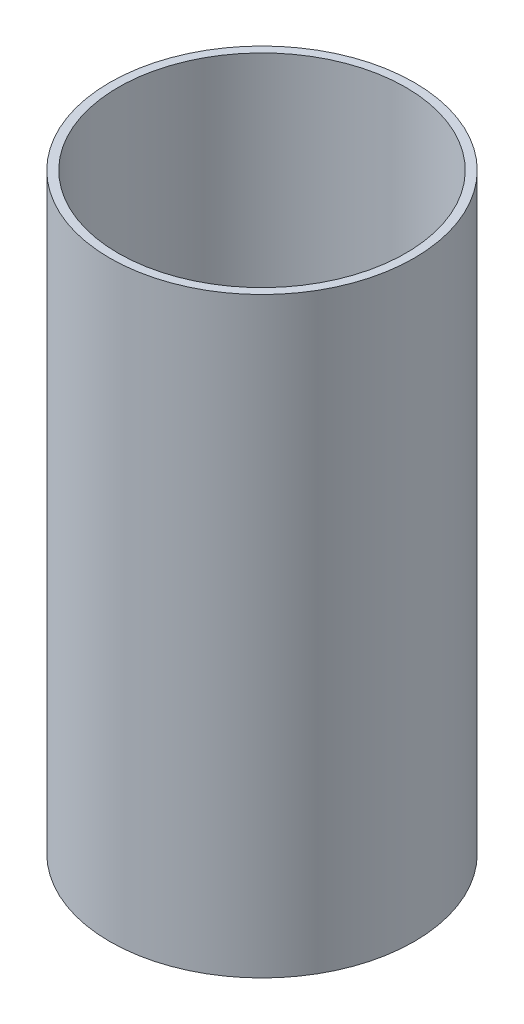
ISO-10303-21;
HEADER;
FILE_DESCRIPTION(('STEP AP214'),'2;1');
FILE_NAME('part.step','',(''),(''),'','','');
FILE_SCHEMA(('AUTOMOTIVE_DESIGN { 1 0 10303 214 1 1 1 1 }'));
ENDSEC;
DATA;
#1=APPLICATION_CONTEXT('core data for automotive mechanical design processes');
#2=APPLICATION_PROTOCOL_DEFINITION('international standard','automotive_design',2000,#1);
#3=PRODUCT_CONTEXT('',#1,'mechanical');
#4=PRODUCT('Part','Part','',(#3));
#5=PRODUCT_RELATED_PRODUCT_CATEGORY('part','',(#4));
#6=PRODUCT_DEFINITION_FORMATION('','',#4);
#7=PRODUCT_DEFINITION_CONTEXT('part definition',#1,'design');
#8=PRODUCT_DEFINITION('design','',#6,#7);
#9=PRODUCT_DEFINITION_SHAPE('','',#8);
#10=(LENGTH_UNIT() NAMED_UNIT(*) SI_UNIT(.MILLI.,.METRE.));
#11=(NAMED_UNIT(*) PLANE_ANGLE_UNIT() SI_UNIT($,.RADIAN.));
#12=(NAMED_UNIT(*) SI_UNIT($,.STERADIAN.) SOLID_ANGLE_UNIT());
#13=UNCERTAINTY_MEASURE_WITH_UNIT(LENGTH_MEASURE(1.E-05),#10,'distance_accuracy_value','');
#14=(GEOMETRIC_REPRESENTATION_CONTEXT(3) GLOBAL_UNCERTAINTY_ASSIGNED_CONTEXT((#13)) GLOBAL_UNIT_ASSIGNED_CONTEXT((#10,
#11,#12)) REPRESENTATION_CONTEXT('',''));
#15=CARTESIAN_POINT('',(0.,0.,0.));
#16=DIRECTION('',(0.,0.,1.));
#17=DIRECTION('',(1.,0.,0.));
#18=AXIS2_PLACEMENT_3D('',#15,#16,#17);
#19=CARTESIAN_POINT('',(0.,105.,0.));
#20=DIRECTION('',(0.,1.,0.));
#21=DIRECTION('',(0.,0.,1.));
#22=AXIS2_PLACEMENT_3D('',#19,#20,#21);
#23=PLANE('',#22);
#24=CARTESIAN_POINT('',(0.,105.,0.));
#25=DIRECTION('',(0.,1.,0.));
#26=DIRECTION('',(0.,0.,1.));
#27=AXIS2_PLACEMENT_3D('',#24,#25,#26);
#28=CIRCLE('',#27,27.);
#29=CARTESIAN_POINT('',(0.,105.,27.));
#30=VERTEX_POINT('',#29);
#31=EDGE_CURVE('E10',#30,#30,#28,.T.);
#32=ORIENTED_EDGE('',*,*,#31,.T.);
#33=EDGE_LOOP('',(#32));
#34=FACE_BOUND('',#33,.T.);
#35=CARTESIAN_POINT('',(0.,105.,0.));
#36=DIRECTION('',(0.,1.,0.));
#37=DIRECTION('',(0.,0.,1.));
#38=AXIS2_PLACEMENT_3D('',#35,#36,#37);
#39=CIRCLE('',#38,25.5);
#40=CARTESIAN_POINT('',(0.,105.,25.5));
#41=VERTEX_POINT('',#40);
#42=EDGE_CURVE('E42',#41,#41,#39,.T.);
#43=ORIENTED_EDGE('',*,*,#42,.F.);
#44=EDGE_LOOP('',(#43));
#45=FACE_BOUND('',#44,.T.);
#46=ADVANCED_FACE('F31',(#34,#45),#23,.T.);
#47=CARTESIAN_POINT('',(0.,0.,0.));
#48=DIRECTION('',(0.,1.,0.));
#49=DIRECTION('',(0.,0.,1.));
#50=AXIS2_PLACEMENT_3D('',#47,#48,#49);
#51=PLANE('',#50);
#52=CARTESIAN_POINT('',(0.,0.,0.));
#53=DIRECTION('',(0.,1.,0.));
#54=DIRECTION('',(0.,0.,1.));
#55=AXIS2_PLACEMENT_3D('',#52,#53,#54);
#56=CIRCLE('',#55,27.);
#57=CARTESIAN_POINT('',(0.,0.,27.));
#58=VERTEX_POINT('',#57);
#59=EDGE_CURVE('E35',#58,#58,#56,.T.);
#60=ORIENTED_EDGE('',*,*,#59,.F.);
#61=EDGE_LOOP('',(#60));
#62=FACE_BOUND('',#61,.T.);
#63=CARTESIAN_POINT('',(0.,0.,0.));
#64=DIRECTION('',(0.,1.,0.));
#65=DIRECTION('',(0.,0.,1.));
#66=AXIS2_PLACEMENT_3D('',#63,#64,#65);
#67=CIRCLE('',#66,25.5);
#68=CARTESIAN_POINT('',(0.,0.,25.5));
#69=VERTEX_POINT('',#68);
#70=EDGE_CURVE('E44',#69,#69,#67,.T.);
#71=ORIENTED_EDGE('',*,*,#70,.T.);
#72=EDGE_LOOP('',(#71));
#73=FACE_BOUND('',#72,.T.);
#74=ADVANCED_FACE('F54',(#62,#73),#51,.F.);
#75=CARTESIAN_POINT('',(0.,105.,0.));
#76=DIRECTION('',(0.,-1.,0.));
#77=DIRECTION('',(0.,0.,-1.));
#78=AXIS2_PLACEMENT_3D('',#75,#76,#77);
#79=CYLINDRICAL_SURFACE('',#78,27.);
#80=ORIENTED_EDGE('',*,*,#31,.F.);
#81=EDGE_LOOP('',(#80));
#82=FACE_BOUND('',#81,.T.);
#83=ORIENTED_EDGE('',*,*,#59,.T.);
#84=EDGE_LOOP('',(#83));
#85=FACE_BOUND('',#84,.T.);
#86=ADVANCED_FACE('F33',(#82,#85),#79,.T.);
#87=CARTESIAN_POINT('',(0.,105.,0.));
#88=DIRECTION('',(0.,-1.,0.));
#89=DIRECTION('',(0.,0.,-1.));
#90=AXIS2_PLACEMENT_3D('',#87,#88,#89);
#91=CYLINDRICAL_SURFACE('',#90,25.5);
#92=ORIENTED_EDGE('',*,*,#42,.T.);
#93=EDGE_LOOP('',(#92));
#94=FACE_BOUND('',#93,.T.);
#95=ORIENTED_EDGE('',*,*,#70,.F.);
#96=EDGE_LOOP('',(#95));
#97=FACE_BOUND('',#96,.T.);
#98=ADVANCED_FACE('F50',(#94,#97),#91,.F.);
#99=CLOSED_SHELL('',(#46,#74,#86,#98));
#100=MANIFOLD_SOLID_BREP('B2',#99);
#101=ADVANCED_BREP_SHAPE_REPRESENTATION('',(#18,#100),#14);
#102=SHAPE_DEFINITION_REPRESENTATION(#9,#101);
ENDSEC;
END-ISO-10303-21;
